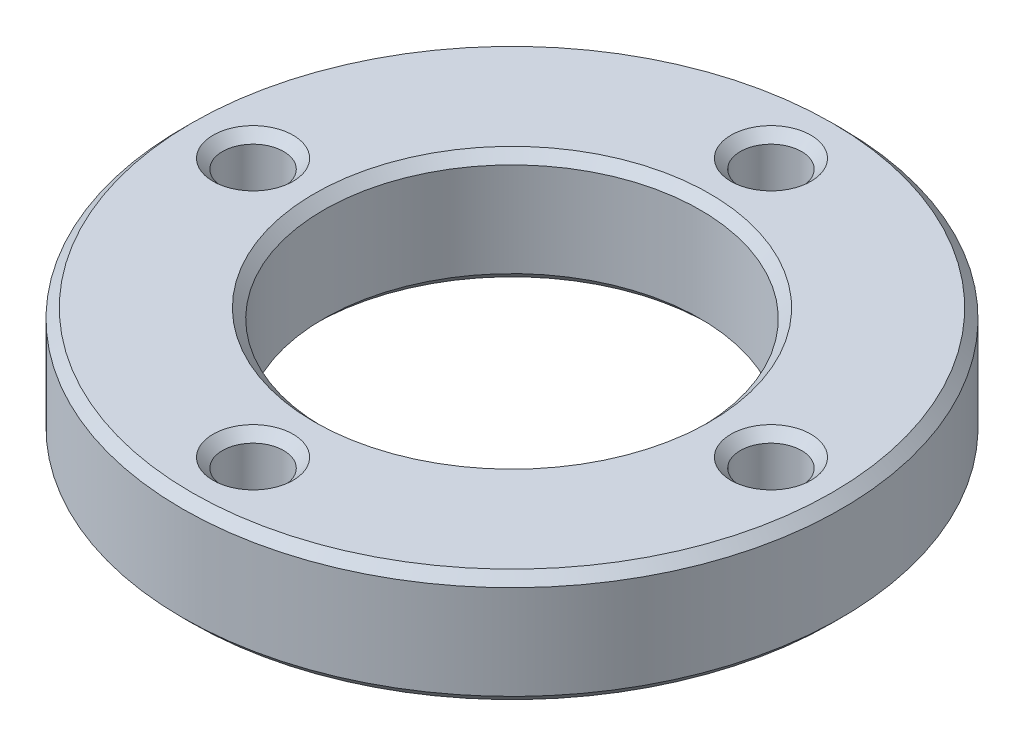
ISO-10303-21;
HEADER;
FILE_DESCRIPTION(('STEP AP214'),'2;1');
FILE_NAME('part.step','',(''),(''),'','','');
FILE_SCHEMA(('AUTOMOTIVE_DESIGN { 1 0 10303 214 1 1 1 1 }'));
ENDSEC;
DATA;
#1=APPLICATION_CONTEXT('core data for automotive mechanical design processes');
#2=APPLICATION_PROTOCOL_DEFINITION('international standard','automotive_design',2000,#1);
#3=PRODUCT_CONTEXT('',#1,'mechanical');
#4=PRODUCT('Part','Part','',(#3));
#5=PRODUCT_RELATED_PRODUCT_CATEGORY('part','',(#4));
#6=PRODUCT_DEFINITION_FORMATION('','',#4);
#7=PRODUCT_DEFINITION_CONTEXT('part definition',#1,'design');
#8=PRODUCT_DEFINITION('design','',#6,#7);
#9=PRODUCT_DEFINITION_SHAPE('','',#8);
#10=(LENGTH_UNIT() NAMED_UNIT(*) SI_UNIT(.MILLI.,.METRE.));
#11=(NAMED_UNIT(*) PLANE_ANGLE_UNIT() SI_UNIT($,.RADIAN.));
#12=(NAMED_UNIT(*) SI_UNIT($,.STERADIAN.) SOLID_ANGLE_UNIT());
#13=UNCERTAINTY_MEASURE_WITH_UNIT(LENGTH_MEASURE(1.E-05),#10,'distance_accuracy_value','');
#14=(GEOMETRIC_REPRESENTATION_CONTEXT(3) GLOBAL_UNCERTAINTY_ASSIGNED_CONTEXT((#13)) GLOBAL_UNIT_ASSIGNED_CONTEXT((#10,
#11,#12)) REPRESENTATION_CONTEXT('',''));
#15=CARTESIAN_POINT('',(0.,0.,0.));
#16=DIRECTION('',(0.,0.,1.));
#17=DIRECTION('',(1.,0.,0.));
#18=AXIS2_PLACEMENT_3D('',#15,#16,#17);
#19=CARTESIAN_POINT('',(0.,12.,0.));
#20=DIRECTION('',(0.,1.,0.));
#21=DIRECTION('',(0.,0.,1.));
#22=AXIS2_PLACEMENT_3D('',#19,#20,#21);
#23=PLANE('',#22);
#24=CARTESIAN_POINT('',(0.,12.,-27.5));
#25=DIRECTION('',(0.,1.,0.));
#26=DIRECTION('',(0.,0.,1.));
#27=AXIS2_PLACEMENT_3D('',#24,#25,#26);
#28=CIRCLE('',#27,4.25000000000001);
#29=CARTESIAN_POINT('',(0.,12.,-23.25));
#30=VERTEX_POINT('',#29);
#31=EDGE_CURVE('E10',#30,#30,#28,.F.);
#32=ORIENTED_EDGE('',*,*,#31,.T.);
#33=EDGE_LOOP('',(#32));
#34=FACE_BOUND('',#33,.T.);
#35=CARTESIAN_POINT('',(0.,12.,27.5));
#36=DIRECTION('',(0.,1.,0.));
#37=DIRECTION('',(0.,0.,1.));
#38=AXIS2_PLACEMENT_3D('',#35,#36,#37);
#39=CIRCLE('',#38,4.25000000000001);
#40=CARTESIAN_POINT('',(0.,12.,31.75));
#41=VERTEX_POINT('',#40);
#42=EDGE_CURVE('E48',#41,#41,#39,.F.);
#43=ORIENTED_EDGE('',*,*,#42,.T.);
#44=EDGE_LOOP('',(#43));
#45=FACE_BOUND('',#44,.T.);
#46=CARTESIAN_POINT('',(0.,12.,0.));
#47=DIRECTION('',(0.,1.,0.));
#48=DIRECTION('',(0.,0.,1.));
#49=AXIS2_PLACEMENT_3D('',#46,#47,#48);
#50=CIRCLE('',#49,21.);
#51=CARTESIAN_POINT('',(0.,12.,21.));
#52=VERTEX_POINT('',#51);
#53=EDGE_CURVE('E53',#52,#52,#50,.F.);
#54=ORIENTED_EDGE('',*,*,#53,.T.);
#55=EDGE_LOOP('',(#54));
#56=FACE_BOUND('',#55,.T.);
#57=CARTESIAN_POINT('',(0.,12.,0.));
#58=DIRECTION('',(0.,1.,0.));
#59=DIRECTION('',(0.,0.,1.));
#60=AXIS2_PLACEMENT_3D('',#57,#58,#59);
#61=CIRCLE('',#60,34.);
#62=CARTESIAN_POINT('',(0.,12.,34.));
#63=VERTEX_POINT('',#62);
#64=EDGE_CURVE('E58',#63,#63,#61,.T.);
#65=ORIENTED_EDGE('',*,*,#64,.T.);
#66=EDGE_LOOP('',(#65));
#67=FACE_BOUND('',#66,.T.);
#68=CARTESIAN_POINT('',(27.5,12.,0.));
#69=DIRECTION('',(0.,1.,0.));
#70=DIRECTION('',(0.,0.,1.));
#71=AXIS2_PLACEMENT_3D('',#68,#69,#70);
#72=CIRCLE('',#71,4.24999999999999);
#73=CARTESIAN_POINT('',(27.5,12.,4.24999999999999));
#74=VERTEX_POINT('',#73);
#75=EDGE_CURVE('E64',#74,#74,#72,.F.);
#76=ORIENTED_EDGE('',*,*,#75,.T.);
#77=EDGE_LOOP('',(#76));
#78=FACE_BOUND('',#77,.T.);
#79=CARTESIAN_POINT('',(-27.5,12.,0.));
#80=DIRECTION('',(0.,1.,0.));
#81=DIRECTION('',(0.,0.,1.));
#82=AXIS2_PLACEMENT_3D('',#79,#80,#81);
#83=CIRCLE('',#82,4.24999999999999);
#84=CARTESIAN_POINT('',(-27.5,12.,4.24999999999999));
#85=VERTEX_POINT('',#84);
#86=EDGE_CURVE('E68',#85,#85,#83,.F.);
#87=ORIENTED_EDGE('',*,*,#86,.T.);
#88=EDGE_LOOP('',(#87));
#89=FACE_BOUND('',#88,.T.);
#90=ADVANCED_FACE('F39',(#34,#45,#56,#67,#78,#89),#23,.T.);
#91=CARTESIAN_POINT('',(0.,0.,0.));
#92=DIRECTION('',(0.,1.,0.));
#93=DIRECTION('',(0.,0.,1.));
#94=AXIS2_PLACEMENT_3D('',#91,#92,#93);
#95=PLANE('',#94);
#96=CARTESIAN_POINT('',(0.,0.,-27.5));
#97=DIRECTION('',(0.,1.,0.));
#98=DIRECTION('',(0.,0.,1.));
#99=AXIS2_PLACEMENT_3D('',#96,#97,#98);
#100=CIRCLE('',#99,4.24999999999999);
#101=CARTESIAN_POINT('',(0.,0.,-23.25));
#102=VERTEX_POINT('',#101);
#103=EDGE_CURVE('E120',#102,#102,#100,.T.);
#104=ORIENTED_EDGE('',*,*,#103,.T.);
#105=EDGE_LOOP('',(#104));
#106=FACE_BOUND('',#105,.T.);
#107=CARTESIAN_POINT('',(-27.5,0.,0.));
#108=DIRECTION('',(0.,1.,0.));
#109=DIRECTION('',(0.,0.,1.));
#110=AXIS2_PLACEMENT_3D('',#107,#108,#109);
#111=CIRCLE('',#110,4.24999999999998);
#112=CARTESIAN_POINT('',(-27.5,0.,4.24999999999998));
#113=VERTEX_POINT('',#112);
#114=EDGE_CURVE('E124',#113,#113,#111,.T.);
#115=ORIENTED_EDGE('',*,*,#114,.T.);
#116=EDGE_LOOP('',(#115));
#117=FACE_BOUND('',#116,.T.);
#118=CARTESIAN_POINT('',(0.,0.,27.5));
#119=DIRECTION('',(0.,1.,0.));
#120=DIRECTION('',(0.,0.,1.));
#121=AXIS2_PLACEMENT_3D('',#118,#119,#120);
#122=CIRCLE('',#121,4.24999999999999);
#123=CARTESIAN_POINT('',(0.,0.,31.75));
#124=VERTEX_POINT('',#123);
#125=EDGE_CURVE('E128',#124,#124,#122,.T.);
#126=ORIENTED_EDGE('',*,*,#125,.T.);
#127=EDGE_LOOP('',(#126));
#128=FACE_BOUND('',#127,.T.);
#129=CARTESIAN_POINT('',(27.5,0.,0.));
#130=DIRECTION('',(0.,1.,0.));
#131=DIRECTION('',(0.,0.,1.));
#132=AXIS2_PLACEMENT_3D('',#129,#130,#131);
#133=CIRCLE('',#132,4.24999999999998);
#134=CARTESIAN_POINT('',(27.5,0.,4.24999999999998));
#135=VERTEX_POINT('',#134);
#136=EDGE_CURVE('E132',#135,#135,#133,.T.);
#137=ORIENTED_EDGE('',*,*,#136,.T.);
#138=EDGE_LOOP('',(#137));
#139=FACE_BOUND('',#138,.T.);
#140=CARTESIAN_POINT('',(0.,0.,0.));
#141=DIRECTION('',(0.,1.,0.));
#142=DIRECTION('',(0.,0.,1.));
#143=AXIS2_PLACEMENT_3D('',#140,#141,#142);
#144=CIRCLE('',#143,21.);
#145=CARTESIAN_POINT('',(0.,0.,21.));
#146=VERTEX_POINT('',#145);
#147=EDGE_CURVE('E136',#146,#146,#144,.T.);
#148=ORIENTED_EDGE('',*,*,#147,.T.);
#149=EDGE_LOOP('',(#148));
#150=FACE_BOUND('',#149,.T.);
#151=CARTESIAN_POINT('',(0.,0.,0.));
#152=DIRECTION('',(0.,1.,0.));
#153=DIRECTION('',(0.,0.,1.));
#154=AXIS2_PLACEMENT_3D('',#151,#152,#153);
#155=CIRCLE('',#154,34.);
#156=CARTESIAN_POINT('',(0.,0.,34.));
#157=VERTEX_POINT('',#156);
#158=EDGE_CURVE('E140',#157,#157,#155,.F.);
#159=ORIENTED_EDGE('',*,*,#158,.T.);
#160=EDGE_LOOP('',(#159));
#161=FACE_BOUND('',#160,.T.);
#162=ADVANCED_FACE('F145',(#106,#117,#128,#139,#150,#161),#95,.F.);
#163=CARTESIAN_POINT('',(0.,12.,0.));
#164=DIRECTION('',(0.,-1.,0.));
#165=DIRECTION('',(0.,0.,-1.));
#166=AXIS2_PLACEMENT_3D('',#163,#164,#165);
#167=CYLINDRICAL_SURFACE('',#166,35.);
#168=CARTESIAN_POINT('',(0.,1.00000000000001,0.));
#169=DIRECTION('',(0.,1.,0.));
#170=DIRECTION('',(0.,0.,1.));
#171=AXIS2_PLACEMENT_3D('',#168,#169,#170);
#172=CIRCLE('',#171,35.);
#173=CARTESIAN_POINT('',(0.,1.00000000000001,35.));
#174=VERTEX_POINT('',#173);
#175=EDGE_CURVE('E72',#174,#174,#172,.T.);
#176=ORIENTED_EDGE('',*,*,#175,.T.);
#177=EDGE_LOOP('',(#176));
#178=FACE_BOUND('',#177,.T.);
#179=CARTESIAN_POINT('',(0.,11.,0.));
#180=DIRECTION('',(0.,1.,0.));
#181=DIRECTION('',(0.,0.,1.));
#182=AXIS2_PLACEMENT_3D('',#179,#180,#181);
#183=CIRCLE('',#182,35.);
#184=CARTESIAN_POINT('',(0.,11.,35.));
#185=VERTEX_POINT('',#184);
#186=EDGE_CURVE('E76',#185,#185,#183,.F.);
#187=ORIENTED_EDGE('',*,*,#186,.T.);
#188=EDGE_LOOP('',(#187));
#189=FACE_BOUND('',#188,.T.);
#190=ADVANCED_FACE('F155',(#178,#189),#167,.T.);
#191=CARTESIAN_POINT('',(0.,12.,0.));
#192=DIRECTION('',(0.,-1.,0.));
#193=DIRECTION('',(0.,0.,-1.));
#194=AXIS2_PLACEMENT_3D('',#191,#192,#193);
#195=CYLINDRICAL_SURFACE('',#194,20.);
#196=CARTESIAN_POINT('',(0.,1.00000000000001,0.));
#197=DIRECTION('',(0.,1.,0.));
#198=DIRECTION('',(0.,0.,1.));
#199=AXIS2_PLACEMENT_3D('',#196,#197,#198);
#200=CIRCLE('',#199,20.);
#201=CARTESIAN_POINT('',(0.,1.00000000000001,20.));
#202=VERTEX_POINT('',#201);
#203=EDGE_CURVE('E80',#202,#202,#200,.F.);
#204=ORIENTED_EDGE('',*,*,#203,.T.);
#205=EDGE_LOOP('',(#204));
#206=FACE_BOUND('',#205,.T.);
#207=CARTESIAN_POINT('',(0.,11.,0.));
#208=DIRECTION('',(0.,1.,0.));
#209=DIRECTION('',(0.,0.,1.));
#210=AXIS2_PLACEMENT_3D('',#207,#208,#209);
#211=CIRCLE('',#210,20.);
#212=CARTESIAN_POINT('',(0.,11.,20.));
#213=VERTEX_POINT('',#212);
#214=EDGE_CURVE('E84',#213,#213,#211,.T.);
#215=ORIENTED_EDGE('',*,*,#214,.T.);
#216=EDGE_LOOP('',(#215));
#217=FACE_BOUND('',#216,.T.);
#218=ADVANCED_FACE('F158',(#206,#217),#195,.F.);
#219=CARTESIAN_POINT('',(27.5,12.,0.));
#220=DIRECTION('',(0.,-1.,0.));
#221=DIRECTION('',(0.,0.,-1.));
#222=AXIS2_PLACEMENT_3D('',#219,#220,#221);
#223=CYLINDRICAL_SURFACE('',#222,3.25);
#224=CARTESIAN_POINT('',(27.5,0.999999999999978,0.));
#225=DIRECTION('',(0.,1.,0.));
#226=DIRECTION('',(0.,0.,1.));
#227=AXIS2_PLACEMENT_3D('',#224,#225,#226);
#228=CIRCLE('',#227,3.25);
#229=CARTESIAN_POINT('',(27.5,0.999999999999978,3.25));
#230=VERTEX_POINT('',#229);
#231=EDGE_CURVE('E88',#230,#230,#228,.F.);
#232=ORIENTED_EDGE('',*,*,#231,.T.);
#233=EDGE_LOOP('',(#232));
#234=FACE_BOUND('',#233,.T.);
#235=CARTESIAN_POINT('',(27.5,11.,0.));
#236=DIRECTION('',(0.,1.,0.));
#237=DIRECTION('',(0.,0.,1.));
#238=AXIS2_PLACEMENT_3D('',#235,#236,#237);
#239=CIRCLE('',#238,3.25);
#240=CARTESIAN_POINT('',(27.5,11.,3.25));
#241=VERTEX_POINT('',#240);
#242=EDGE_CURVE('E92',#241,#241,#239,.T.);
#243=ORIENTED_EDGE('',*,*,#242,.T.);
#244=EDGE_LOOP('',(#243));
#245=FACE_BOUND('',#244,.T.);
#246=ADVANCED_FACE('F194',(#234,#245),#223,.F.);
#247=CARTESIAN_POINT('',(0.,12.,27.5));
#248=DIRECTION('',(0.,-1.,0.));
#249=DIRECTION('',(0.,0.,-1.));
#250=AXIS2_PLACEMENT_3D('',#247,#248,#249);
#251=CYLINDRICAL_SURFACE('',#250,3.25);
#252=CARTESIAN_POINT('',(0.,1.00000000000001,27.5));
#253=DIRECTION('',(0.,1.,0.));
#254=DIRECTION('',(0.,0.,1.));
#255=AXIS2_PLACEMENT_3D('',#252,#253,#254);
#256=CIRCLE('',#255,3.25);
#257=CARTESIAN_POINT('',(0.,1.00000000000001,30.75));
#258=VERTEX_POINT('',#257);
#259=EDGE_CURVE('E96',#258,#258,#256,.F.);
#260=ORIENTED_EDGE('',*,*,#259,.T.);
#261=EDGE_LOOP('',(#260));
#262=FACE_BOUND('',#261,.T.);
#263=CARTESIAN_POINT('',(0.,11.,27.5));
#264=DIRECTION('',(0.,1.,0.));
#265=DIRECTION('',(0.,0.,1.));
#266=AXIS2_PLACEMENT_3D('',#263,#264,#265);
#267=CIRCLE('',#266,3.25);
#268=CARTESIAN_POINT('',(0.,11.,30.75));
#269=VERTEX_POINT('',#268);
#270=EDGE_CURVE('E100',#269,#269,#267,.T.);
#271=ORIENTED_EDGE('',*,*,#270,.T.);
#272=EDGE_LOOP('',(#271));
#273=FACE_BOUND('',#272,.T.);
#274=ADVANCED_FACE('F184',(#262,#273),#251,.F.);
#275=CARTESIAN_POINT('',(-27.5,12.,0.));
#276=DIRECTION('',(0.,-1.,0.));
#277=DIRECTION('',(0.,0.,-1.));
#278=AXIS2_PLACEMENT_3D('',#275,#276,#277);
#279=CYLINDRICAL_SURFACE('',#278,3.25);
#280=CARTESIAN_POINT('',(-27.5,0.999999999999978,0.));
#281=DIRECTION('',(0.,1.,0.));
#282=DIRECTION('',(0.,0.,1.));
#283=AXIS2_PLACEMENT_3D('',#280,#281,#282);
#284=CIRCLE('',#283,3.25);
#285=CARTESIAN_POINT('',(-27.5,0.999999999999978,3.25));
#286=VERTEX_POINT('',#285);
#287=EDGE_CURVE('E104',#286,#286,#284,.F.);
#288=ORIENTED_EDGE('',*,*,#287,.T.);
#289=EDGE_LOOP('',(#288));
#290=FACE_BOUND('',#289,.T.);
#291=CARTESIAN_POINT('',(-27.5,11.,0.));
#292=DIRECTION('',(0.,1.,0.));
#293=DIRECTION('',(0.,0.,1.));
#294=AXIS2_PLACEMENT_3D('',#291,#292,#293);
#295=CIRCLE('',#294,3.25);
#296=CARTESIAN_POINT('',(-27.5,11.,3.25));
#297=VERTEX_POINT('',#296);
#298=EDGE_CURVE('E108',#297,#297,#295,.T.);
#299=ORIENTED_EDGE('',*,*,#298,.T.);
#300=EDGE_LOOP('',(#299));
#301=FACE_BOUND('',#300,.T.);
#302=ADVANCED_FACE('F181',(#290,#301),#279,.F.);
#303=CARTESIAN_POINT('',(0.,12.,-27.5));
#304=DIRECTION('',(0.,-1.,0.));
#305=DIRECTION('',(0.,0.,-1.));
#306=AXIS2_PLACEMENT_3D('',#303,#304,#305);
#307=CYLINDRICAL_SURFACE('',#306,3.25);
#308=CARTESIAN_POINT('',(0.,1.00000000000001,-27.5));
#309=DIRECTION('',(0.,1.,0.));
#310=DIRECTION('',(0.,0.,1.));
#311=AXIS2_PLACEMENT_3D('',#308,#309,#310);
#312=CIRCLE('',#311,3.25);
#313=CARTESIAN_POINT('',(0.,1.00000000000001,-24.25));
#314=VERTEX_POINT('',#313);
#315=EDGE_CURVE('E112',#314,#314,#312,.F.);
#316=ORIENTED_EDGE('',*,*,#315,.T.);
#317=EDGE_LOOP('',(#316));
#318=FACE_BOUND('',#317,.T.);
#319=CARTESIAN_POINT('',(0.,11.,-27.5));
#320=DIRECTION('',(0.,1.,0.));
#321=DIRECTION('',(0.,0.,1.));
#322=AXIS2_PLACEMENT_3D('',#319,#320,#321);
#323=CIRCLE('',#322,3.25);
#324=CARTESIAN_POINT('',(0.,11.,-24.25));
#325=VERTEX_POINT('',#324);
#326=EDGE_CURVE('E116',#325,#325,#323,.T.);
#327=ORIENTED_EDGE('',*,*,#326,.T.);
#328=EDGE_LOOP('',(#327));
#329=FACE_BOUND('',#328,.T.);
#330=ADVANCED_FACE('F183',(#318,#329),#307,.F.);
#331=CARTESIAN_POINT('',(0.,0.,-27.5));
#332=DIRECTION('',(0.,-1.,0.));
#333=DIRECTION('',(0.,0.,-1.));
#334=AXIS2_PLACEMENT_3D('',#331,#332,#333);
#335=CONICAL_SURFACE('',#334,4.24999999999999,0.785398163397439);
#336=ORIENTED_EDGE('',*,*,#315,.F.);
#337=EDGE_LOOP('',(#336));
#338=FACE_BOUND('',#337,.T.);
#339=ORIENTED_EDGE('',*,*,#103,.F.);
#340=EDGE_LOOP('',(#339));
#341=FACE_BOUND('',#340,.T.);
#342=ADVANCED_FACE('F191',(#338,#341),#335,.F.);
#343=CARTESIAN_POINT('',(-27.5,0.,0.));
#344=DIRECTION('',(0.,-1.,0.));
#345=DIRECTION('',(0.,0.,-1.));
#346=AXIS2_PLACEMENT_3D('',#343,#344,#345);
#347=CONICAL_SURFACE('',#346,4.24999999999998,0.785398163397447);
#348=ORIENTED_EDGE('',*,*,#287,.F.);
#349=EDGE_LOOP('',(#348));
#350=FACE_BOUND('',#349,.T.);
#351=ORIENTED_EDGE('',*,*,#114,.F.);
#352=EDGE_LOOP('',(#351));
#353=FACE_BOUND('',#352,.T.);
#354=ADVANCED_FACE('F213',(#350,#353),#347,.F.);
#355=CARTESIAN_POINT('',(0.,0.,27.5));
#356=DIRECTION('',(0.,-1.,0.));
#357=DIRECTION('',(0.,0.,-1.));
#358=AXIS2_PLACEMENT_3D('',#355,#356,#357);
#359=CONICAL_SURFACE('',#358,4.24999999999999,0.78539816339744);
#360=ORIENTED_EDGE('',*,*,#259,.F.);
#361=EDGE_LOOP('',(#360));
#362=FACE_BOUND('',#361,.T.);
#363=ORIENTED_EDGE('',*,*,#125,.F.);
#364=EDGE_LOOP('',(#363));
#365=FACE_BOUND('',#364,.T.);
#366=ADVANCED_FACE('F220',(#362,#365),#359,.F.);
#367=CARTESIAN_POINT('',(27.5,0.,0.));
#368=DIRECTION('',(0.,-1.,0.));
#369=DIRECTION('',(0.,0.,-1.));
#370=AXIS2_PLACEMENT_3D('',#367,#368,#369);
#371=CONICAL_SURFACE('',#370,4.24999999999998,0.785398163397447);
#372=ORIENTED_EDGE('',*,*,#231,.F.);
#373=EDGE_LOOP('',(#372));
#374=FACE_BOUND('',#373,.T.);
#375=ORIENTED_EDGE('',*,*,#136,.F.);
#376=EDGE_LOOP('',(#375));
#377=FACE_BOUND('',#376,.T.);
#378=ADVANCED_FACE('F227',(#374,#377),#371,.F.);
#379=CARTESIAN_POINT('',(0.,0.,0.));
#380=DIRECTION('',(0.,-1.,0.));
#381=DIRECTION('',(0.,0.,-1.));
#382=AXIS2_PLACEMENT_3D('',#379,#380,#381);
#383=CONICAL_SURFACE('',#382,21.,0.785398163397445);
#384=ORIENTED_EDGE('',*,*,#203,.F.);
#385=EDGE_LOOP('',(#384));
#386=FACE_BOUND('',#385,.T.);
#387=ORIENTED_EDGE('',*,*,#147,.F.);
#388=EDGE_LOOP('',(#387));
#389=FACE_BOUND('',#388,.T.);
#390=ADVANCED_FACE('F151',(#386,#389),#383,.F.);
#391=CARTESIAN_POINT('',(0.,1.00000000000001,0.));
#392=DIRECTION('',(0.,1.,0.));
#393=DIRECTION('',(0.,0.,1.));
#394=AXIS2_PLACEMENT_3D('',#391,#392,#393);
#395=CONICAL_SURFACE('',#394,35.,0.785398163397445);
#396=ORIENTED_EDGE('',*,*,#158,.F.);
#397=EDGE_LOOP('',(#396));
#398=FACE_BOUND('',#397,.T.);
#399=ORIENTED_EDGE('',*,*,#175,.F.);
#400=EDGE_LOOP('',(#399));
#401=FACE_BOUND('',#400,.T.);
#402=ADVANCED_FACE('F147',(#398,#401),#395,.T.);
#403=CARTESIAN_POINT('',(0.,11.,-27.5));
#404=DIRECTION('',(0.,1.,0.));
#405=DIRECTION('',(0.,0.,1.));
#406=AXIS2_PLACEMENT_3D('',#403,#404,#405);
#407=CONICAL_SURFACE('',#406,3.25,0.785398163397455);
#408=ORIENTED_EDGE('',*,*,#31,.F.);
#409=EDGE_LOOP('',(#408));
#410=FACE_BOUND('',#409,.T.);
#411=ORIENTED_EDGE('',*,*,#326,.F.);
#412=EDGE_LOOP('',(#411));
#413=FACE_BOUND('',#412,.T.);
#414=ADVANCED_FACE('F150',(#410,#413),#407,.F.);
#415=CARTESIAN_POINT('',(0.,11.,27.5));
#416=DIRECTION('',(0.,1.,0.));
#417=DIRECTION('',(0.,0.,1.));
#418=AXIS2_PLACEMENT_3D('',#415,#416,#417);
#419=CONICAL_SURFACE('',#418,3.25,0.785398163397457);
#420=ORIENTED_EDGE('',*,*,#42,.F.);
#421=EDGE_LOOP('',(#420));
#422=FACE_BOUND('',#421,.T.);
#423=ORIENTED_EDGE('',*,*,#270,.F.);
#424=EDGE_LOOP('',(#423));
#425=FACE_BOUND('',#424,.T.);
#426=ADVANCED_FACE('F249',(#422,#425),#419,.F.);
#427=CARTESIAN_POINT('',(0.,11.,0.));
#428=DIRECTION('',(0.,1.,0.));
#429=DIRECTION('',(0.,0.,1.));
#430=AXIS2_PLACEMENT_3D('',#427,#428,#429);
#431=CONICAL_SURFACE('',#430,20.,0.785398163397441);
#432=ORIENTED_EDGE('',*,*,#53,.F.);
#433=EDGE_LOOP('',(#432));
#434=FACE_BOUND('',#433,.T.);
#435=ORIENTED_EDGE('',*,*,#214,.F.);
#436=EDGE_LOOP('',(#435));
#437=FACE_BOUND('',#436,.T.);
#438=ADVANCED_FACE('F166',(#434,#437),#431,.F.);
#439=CARTESIAN_POINT('',(0.,12.,0.));
#440=DIRECTION('',(0.,-1.,0.));
#441=DIRECTION('',(0.,0.,-1.));
#442=AXIS2_PLACEMENT_3D('',#439,#440,#441);
#443=CONICAL_SURFACE('',#442,34.,0.785398163397441);
#444=ORIENTED_EDGE('',*,*,#186,.F.);
#445=EDGE_LOOP('',(#444));
#446=FACE_BOUND('',#445,.T.);
#447=ORIENTED_EDGE('',*,*,#64,.F.);
#448=EDGE_LOOP('',(#447));
#449=FACE_BOUND('',#448,.T.);
#450=ADVANCED_FACE('F162',(#446,#449),#443,.T.);
#451=CARTESIAN_POINT('',(27.5,11.,0.));
#452=DIRECTION('',(0.,1.,0.));
#453=DIRECTION('',(0.,0.,1.));
#454=AXIS2_PLACEMENT_3D('',#451,#452,#453);
#455=CONICAL_SURFACE('',#454,3.25,0.78539816339745);
#456=ORIENTED_EDGE('',*,*,#75,.F.);
#457=EDGE_LOOP('',(#456));
#458=FACE_BOUND('',#457,.T.);
#459=ORIENTED_EDGE('',*,*,#242,.F.);
#460=EDGE_LOOP('',(#459));
#461=FACE_BOUND('',#460,.T.);
#462=ADVANCED_FACE('F165',(#458,#461),#455,.F.);
#463=CARTESIAN_POINT('',(-27.5,11.,0.));
#464=DIRECTION('',(0.,1.,0.));
#465=DIRECTION('',(0.,0.,1.));
#466=AXIS2_PLACEMENT_3D('',#463,#464,#465);
#467=CONICAL_SURFACE('',#466,3.25,0.78539816339745);
#468=ORIENTED_EDGE('',*,*,#86,.F.);
#469=EDGE_LOOP('',(#468));
#470=FACE_BOUND('',#469,.T.);
#471=ORIENTED_EDGE('',*,*,#298,.F.);
#472=EDGE_LOOP('',(#471));
#473=FACE_BOUND('',#472,.T.);
#474=ADVANCED_FACE('F42',(#470,#473),#467,.F.);
#475=CLOSED_SHELL('',(#90,#162,#190,#218,#246,#274,#302,#330,#342,#354,#366,#378,#390,#402,#414,
#426,#438,#450,#462,#474));
#476=MANIFOLD_SOLID_BREP('B2',#475);
#477=ADVANCED_BREP_SHAPE_REPRESENTATION('',(#18,#476),#14);
#478=SHAPE_DEFINITION_REPRESENTATION(#9,#477);
ENDSEC;
END-ISO-10303-21;
